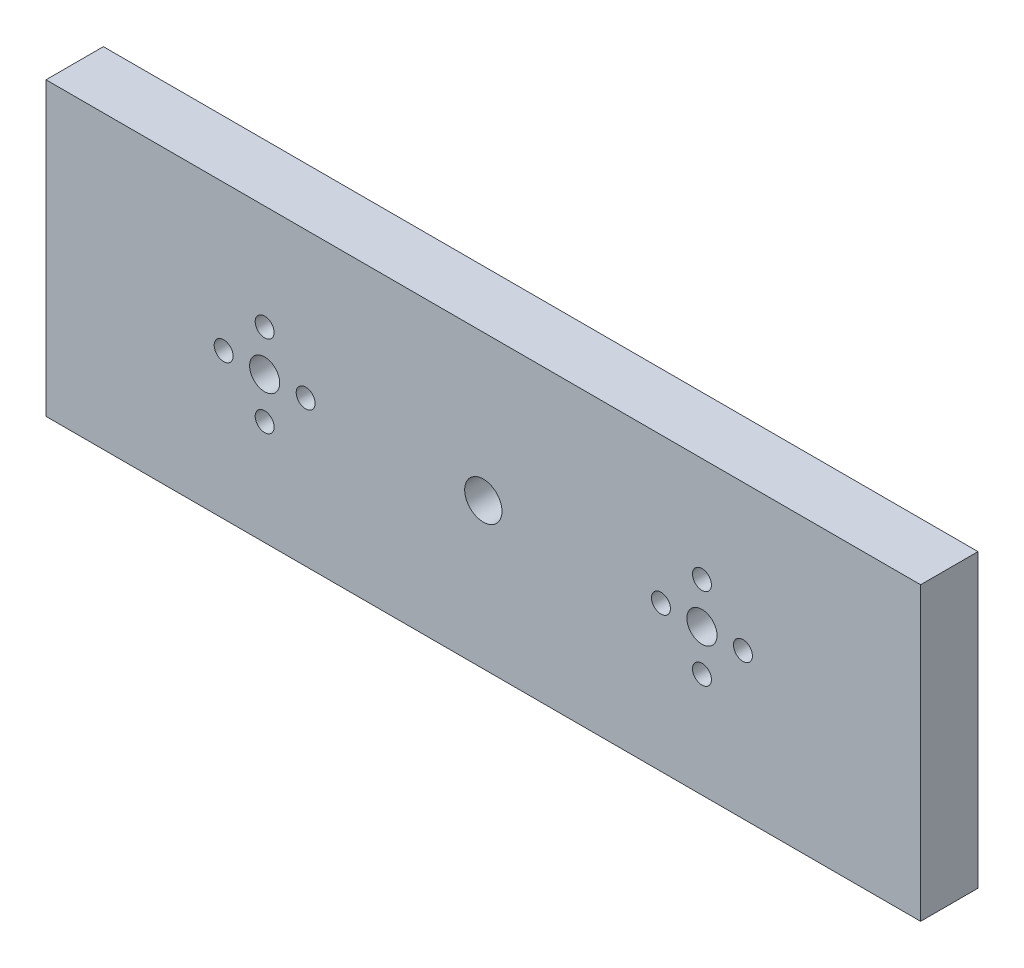
ISO-10303-21;
HEADER;
FILE_DESCRIPTION(('STEP AP214'),'2;1');
FILE_NAME('part.step','',(''),(''),'','','');
FILE_SCHEMA(('AUTOMOTIVE_DESIGN { 1 0 10303 214 1 1 1 1 }'));
ENDSEC;
DATA;
#1=APPLICATION_CONTEXT('core data for automotive mechanical design processes');
#2=APPLICATION_PROTOCOL_DEFINITION('international standard','automotive_design',2000,#1);
#3=PRODUCT_CONTEXT('',#1,'mechanical');
#4=PRODUCT('Part','Part','',(#3));
#5=PRODUCT_RELATED_PRODUCT_CATEGORY('part','',(#4));
#6=PRODUCT_DEFINITION_FORMATION('','',#4);
#7=PRODUCT_DEFINITION_CONTEXT('part definition',#1,'design');
#8=PRODUCT_DEFINITION('design','',#6,#7);
#9=PRODUCT_DEFINITION_SHAPE('','',#8);
#10=(LENGTH_UNIT() NAMED_UNIT(*) SI_UNIT(.MILLI.,.METRE.));
#11=(NAMED_UNIT(*) PLANE_ANGLE_UNIT() SI_UNIT($,.RADIAN.));
#12=(NAMED_UNIT(*) SI_UNIT($,.STERADIAN.) SOLID_ANGLE_UNIT());
#13=UNCERTAINTY_MEASURE_WITH_UNIT(LENGTH_MEASURE(1.E-05),#10,'distance_accuracy_value','');
#14=(GEOMETRIC_REPRESENTATION_CONTEXT(3) GLOBAL_UNCERTAINTY_ASSIGNED_CONTEXT((#13)) GLOBAL_UNIT_ASSIGNED_CONTEXT((#10,
#11,#12)) REPRESENTATION_CONTEXT('',''));
#15=CARTESIAN_POINT('',(0.,0.,0.));
#16=DIRECTION('',(0.,0.,1.));
#17=DIRECTION('',(1.,0.,0.));
#18=AXIS2_PLACEMENT_3D('',#15,#16,#17);
#19=CARTESIAN_POINT('',(76.2,14.2875,0.));
#20=DIRECTION('',(0.,0.,-1.));
#21=DIRECTION('',(1.,0.,0.));
#22=AXIS2_PLACEMENT_3D('',#19,#20,#21);
#23=CYLINDRICAL_SURFACE('',#22,3.3);
#24=DIRECTION('',(0.,0.,1.));
#25=VECTOR('',#24,1.);
#26=CARTESIAN_POINT('',(79.5,14.2875,0.));
#27=LINE('',#26,#25);
#28=CARTESIAN_POINT('',(79.5,14.2875,0.));
#29=VERTEX_POINT('',#28);
#30=CARTESIAN_POINT('',(79.5,14.2875,20.));
#31=VERTEX_POINT('',#30);
#32=EDGE_CURVE('E10',#29,#31,#27,.T.);
#33=ORIENTED_EDGE('',*,*,#32,.T.);
#34=CARTESIAN_POINT('',(76.2,14.2875,20.));
#35=DIRECTION('',(0.,0.,1.));
#36=DIRECTION('',(1.,0.,0.));
#37=AXIS2_PLACEMENT_3D('',#34,#35,#36);
#38=CIRCLE('',#37,3.3);
#39=EDGE_CURVE('E258',#31,#31,#38,.T.);
#40=ORIENTED_EDGE('',*,*,#39,.T.);
#41=ORIENTED_EDGE('',*,*,#32,.F.);
#42=CARTESIAN_POINT('',(76.2,14.2875,0.));
#43=DIRECTION('',(0.,0.,1.));
#44=DIRECTION('',(1.,0.,0.));
#45=AXIS2_PLACEMENT_3D('',#42,#43,#44);
#46=CIRCLE('',#45,3.3);
#47=EDGE_CURVE('E191',#29,#29,#46,.T.);
#48=ORIENTED_EDGE('',*,*,#47,.F.);
#49=EDGE_LOOP('',(#33,#40,#41,#48));
#50=FACE_BOUND('',#49,.T.);
#51=ADVANCED_FACE('F18',(#50),#23,.F.);
#52=CARTESIAN_POINT('',(90.4875,0.,0.));
#53=DIRECTION('',(0.,0.,-1.));
#54=DIRECTION('',(1.,0.,0.));
#55=AXIS2_PLACEMENT_3D('',#52,#53,#54);
#56=CYLINDRICAL_SURFACE('',#55,3.3);
#57=DIRECTION('',(0.,0.,1.));
#58=VECTOR('',#57,1.);
#59=CARTESIAN_POINT('',(93.7875,0.,0.));
#60=LINE('',#59,#58);
#61=CARTESIAN_POINT('',(93.7875,0.,0.));
#62=VERTEX_POINT('',#61);
#63=CARTESIAN_POINT('',(93.7875,0.,20.));
#64=VERTEX_POINT('',#63);
#65=EDGE_CURVE('E27',#62,#64,#60,.T.);
#66=ORIENTED_EDGE('',*,*,#65,.T.);
#67=CARTESIAN_POINT('',(90.4875,0.,20.));
#68=DIRECTION('',(0.,0.,1.));
#69=DIRECTION('',(1.,0.,0.));
#70=AXIS2_PLACEMENT_3D('',#67,#68,#69);
#71=CIRCLE('',#70,3.3);
#72=EDGE_CURVE('E265',#64,#64,#71,.T.);
#73=ORIENTED_EDGE('',*,*,#72,.T.);
#74=ORIENTED_EDGE('',*,*,#65,.F.);
#75=CARTESIAN_POINT('',(90.4875,0.,0.));
#76=DIRECTION('',(0.,0.,1.));
#77=DIRECTION('',(1.,0.,0.));
#78=AXIS2_PLACEMENT_3D('',#75,#76,#77);
#79=CIRCLE('',#78,3.3);
#80=EDGE_CURVE('E178',#62,#62,#79,.T.);
#81=ORIENTED_EDGE('',*,*,#80,.F.);
#82=EDGE_LOOP('',(#66,#73,#74,#81));
#83=FACE_BOUND('',#82,.T.);
#84=ADVANCED_FACE('F410',(#83),#56,.F.);
#85=CARTESIAN_POINT('',(76.2,0.,0.));
#86=DIRECTION('',(0.,0.,-1.));
#87=DIRECTION('',(1.,0.,0.));
#88=AXIS2_PLACEMENT_3D('',#85,#86,#87);
#89=CYLINDRICAL_SURFACE('',#88,5.25);
#90=DIRECTION('',(0.,0.,1.));
#91=VECTOR('',#90,1.);
#92=CARTESIAN_POINT('',(81.45,0.,0.));
#93=LINE('',#92,#91);
#94=CARTESIAN_POINT('',(81.45,0.,0.));
#95=VERTEX_POINT('',#94);
#96=CARTESIAN_POINT('',(81.45,0.,20.));
#97=VERTEX_POINT('',#96);
#98=EDGE_CURVE('E164',#95,#97,#93,.T.);
#99=ORIENTED_EDGE('',*,*,#98,.T.);
#100=CARTESIAN_POINT('',(76.2,0.,20.));
#101=DIRECTION('',(0.,0.,1.));
#102=DIRECTION('',(1.,0.,0.));
#103=AXIS2_PLACEMENT_3D('',#100,#101,#102);
#104=CIRCLE('',#103,5.25);
#105=EDGE_CURVE('E247',#97,#97,#104,.T.);
#106=ORIENTED_EDGE('',*,*,#105,.T.);
#107=ORIENTED_EDGE('',*,*,#98,.F.);
#108=CARTESIAN_POINT('',(76.2,0.,0.));
#109=DIRECTION('',(0.,0.,1.));
#110=DIRECTION('',(1.,0.,0.));
#111=AXIS2_PLACEMENT_3D('',#108,#109,#110);
#112=CIRCLE('',#111,5.25);
#113=EDGE_CURVE('E172',#95,#95,#112,.T.);
#114=ORIENTED_EDGE('',*,*,#113,.F.);
#115=EDGE_LOOP('',(#99,#106,#107,#114));
#116=FACE_BOUND('',#115,.T.);
#117=ADVANCED_FACE('F413',(#116),#89,.F.);
#118=CARTESIAN_POINT('',(61.9125,0.,0.));
#119=DIRECTION('',(0.,0.,-1.));
#120=DIRECTION('',(1.,0.,0.));
#121=AXIS2_PLACEMENT_3D('',#118,#119,#120);
#122=CYLINDRICAL_SURFACE('',#121,3.3);
#123=DIRECTION('',(0.,0.,1.));
#124=VECTOR('',#123,1.);
#125=CARTESIAN_POINT('',(65.2125,0.,0.));
#126=LINE('',#125,#124);
#127=CARTESIAN_POINT('',(65.2125,0.,0.));
#128=VERTEX_POINT('',#127);
#129=CARTESIAN_POINT('',(65.2125,0.,20.));
#130=VERTEX_POINT('',#129);
#131=EDGE_CURVE('E158',#128,#130,#126,.T.);
#132=ORIENTED_EDGE('',*,*,#131,.T.);
#133=CARTESIAN_POINT('',(61.9125,0.,20.));
#134=DIRECTION('',(0.,0.,1.));
#135=DIRECTION('',(1.,0.,0.));
#136=AXIS2_PLACEMENT_3D('',#133,#134,#135);
#137=CIRCLE('',#136,3.3);
#138=EDGE_CURVE('E162',#130,#130,#137,.T.);
#139=ORIENTED_EDGE('',*,*,#138,.T.);
#140=ORIENTED_EDGE('',*,*,#131,.F.);
#141=CARTESIAN_POINT('',(61.9125,0.,0.));
#142=DIRECTION('',(0.,0.,1.));
#143=DIRECTION('',(1.,0.,0.));
#144=AXIS2_PLACEMENT_3D('',#141,#142,#143);
#145=CIRCLE('',#144,3.3);
#146=EDGE_CURVE('E161',#128,#128,#145,.T.);
#147=ORIENTED_EDGE('',*,*,#146,.F.);
#148=EDGE_LOOP('',(#132,#139,#140,#147));
#149=FACE_BOUND('',#148,.T.);
#150=ADVANCED_FACE('F159',(#149),#122,.F.);
#151=CARTESIAN_POINT('',(-76.2,14.2875,0.));
#152=DIRECTION('',(0.,0.,-1.));
#153=DIRECTION('',(1.,0.,0.));
#154=AXIS2_PLACEMENT_3D('',#151,#152,#153);
#155=CYLINDRICAL_SURFACE('',#154,3.3);
#156=DIRECTION('',(0.,0.,1.));
#157=VECTOR('',#156,1.);
#158=CARTESIAN_POINT('',(-72.9,14.2875,0.));
#159=LINE('',#158,#157);
#160=CARTESIAN_POINT('',(-72.9,14.2875,0.));
#161=VERTEX_POINT('',#160);
#162=CARTESIAN_POINT('',(-72.9,14.2875,20.));
#163=VERTEX_POINT('',#162);
#164=EDGE_CURVE('E167',#161,#163,#159,.T.);
#165=ORIENTED_EDGE('',*,*,#164,.T.);
#166=CARTESIAN_POINT('',(-76.2,14.2875,20.));
#167=DIRECTION('',(0.,0.,1.));
#168=DIRECTION('',(1.,0.,0.));
#169=AXIS2_PLACEMENT_3D('',#166,#167,#168);
#170=CIRCLE('',#169,3.3);
#171=EDGE_CURVE('E238',#163,#163,#170,.T.);
#172=ORIENTED_EDGE('',*,*,#171,.T.);
#173=ORIENTED_EDGE('',*,*,#164,.F.);
#174=CARTESIAN_POINT('',(-76.2,14.2875,0.));
#175=DIRECTION('',(0.,0.,1.));
#176=DIRECTION('',(1.,0.,0.));
#177=AXIS2_PLACEMENT_3D('',#174,#175,#176);
#178=CIRCLE('',#177,3.3);
#179=EDGE_CURVE('E174',#161,#161,#178,.T.);
#180=ORIENTED_EDGE('',*,*,#179,.F.);
#181=EDGE_LOOP('',(#165,#172,#173,#180));
#182=FACE_BOUND('',#181,.T.);
#183=ADVANCED_FACE('F427',(#182),#155,.F.);
#184=CARTESIAN_POINT('',(0.,0.,0.));
#185=DIRECTION('',(0.,0.,-1.));
#186=DIRECTION('',(1.,0.,0.));
#187=AXIS2_PLACEMENT_3D('',#184,#185,#186);
#188=CYLINDRICAL_SURFACE('',#187,6.5);
#189=DIRECTION('',(0.,0.,1.));
#190=VECTOR('',#189,1.);
#191=CARTESIAN_POINT('',(6.5,0.,0.));
#192=LINE('',#191,#190);
#193=CARTESIAN_POINT('',(6.5,0.,0.));
#194=VERTEX_POINT('',#193);
#195=CARTESIAN_POINT('',(6.5,0.,20.));
#196=VERTEX_POINT('',#195);
#197=EDGE_CURVE('E280',#194,#196,#192,.T.);
#198=ORIENTED_EDGE('',*,*,#197,.T.);
#199=CARTESIAN_POINT('',(0.,0.,20.));
#200=DIRECTION('',(0.,0.,1.));
#201=DIRECTION('',(1.,0.,0.));
#202=AXIS2_PLACEMENT_3D('',#199,#200,#201);
#203=CIRCLE('',#202,6.5);
#204=EDGE_CURVE('E242',#196,#196,#203,.T.);
#205=ORIENTED_EDGE('',*,*,#204,.T.);
#206=ORIENTED_EDGE('',*,*,#197,.F.);
#207=CARTESIAN_POINT('',(0.,0.,0.));
#208=DIRECTION('',(0.,0.,1.));
#209=DIRECTION('',(1.,0.,0.));
#210=AXIS2_PLACEMENT_3D('',#207,#208,#209);
#211=CIRCLE('',#210,6.5);
#212=EDGE_CURVE('E183',#194,#194,#211,.T.);
#213=ORIENTED_EDGE('',*,*,#212,.F.);
#214=EDGE_LOOP('',(#198,#205,#206,#213));
#215=FACE_BOUND('',#214,.T.);
#216=ADVANCED_FACE('F274',(#215),#188,.F.);
#217=CARTESIAN_POINT('',(-61.9125,0.,0.));
#218=DIRECTION('',(0.,0.,-1.));
#219=DIRECTION('',(1.,0.,0.));
#220=AXIS2_PLACEMENT_3D('',#217,#218,#219);
#221=CYLINDRICAL_SURFACE('',#220,3.3);
#222=DIRECTION('',(0.,0.,1.));
#223=VECTOR('',#222,1.);
#224=CARTESIAN_POINT('',(-58.6125,0.,0.));
#225=LINE('',#224,#223);
#226=CARTESIAN_POINT('',(-58.6125,0.,0.));
#227=VERTEX_POINT('',#226);
#228=CARTESIAN_POINT('',(-58.6125,0.,20.));
#229=VERTEX_POINT('',#228);
#230=EDGE_CURVE('E278',#227,#229,#225,.T.);
#231=ORIENTED_EDGE('',*,*,#230,.T.);
#232=CARTESIAN_POINT('',(-61.9125,0.,20.));
#233=DIRECTION('',(0.,0.,1.));
#234=DIRECTION('',(1.,0.,0.));
#235=AXIS2_PLACEMENT_3D('',#232,#233,#234);
#236=CIRCLE('',#235,3.3);
#237=EDGE_CURVE('E552',#229,#229,#236,.T.);
#238=ORIENTED_EDGE('',*,*,#237,.T.);
#239=ORIENTED_EDGE('',*,*,#230,.F.);
#240=CARTESIAN_POINT('',(-61.9125,0.,0.));
#241=DIRECTION('',(0.,0.,1.));
#242=DIRECTION('',(1.,0.,0.));
#243=AXIS2_PLACEMENT_3D('',#240,#241,#242);
#244=CIRCLE('',#243,3.3);
#245=EDGE_CURVE('E213',#227,#227,#244,.T.);
#246=ORIENTED_EDGE('',*,*,#245,.F.);
#247=EDGE_LOOP('',(#231,#238,#239,#246));
#248=FACE_BOUND('',#247,.T.);
#249=ADVANCED_FACE('F425',(#248),#221,.F.);
#250=CARTESIAN_POINT('',(-76.2,0.,0.));
#251=DIRECTION('',(0.,0.,-1.));
#252=DIRECTION('',(1.,0.,0.));
#253=AXIS2_PLACEMENT_3D('',#250,#251,#252);
#254=CYLINDRICAL_SURFACE('',#253,5.25);
#255=DIRECTION('',(0.,0.,1.));
#256=VECTOR('',#255,1.);
#257=CARTESIAN_POINT('',(-70.95,0.,0.));
#258=LINE('',#257,#256);
#259=CARTESIAN_POINT('',(-70.95,0.,0.));
#260=VERTEX_POINT('',#259);
#261=CARTESIAN_POINT('',(-70.95,0.,20.));
#262=VERTEX_POINT('',#261);
#263=EDGE_CURVE('E287',#260,#262,#258,.T.);
#264=ORIENTED_EDGE('',*,*,#263,.T.);
#265=CARTESIAN_POINT('',(-76.2,0.,20.));
#266=DIRECTION('',(0.,0.,1.));
#267=DIRECTION('',(1.,0.,0.));
#268=AXIS2_PLACEMENT_3D('',#265,#266,#267);
#269=CIRCLE('',#268,5.25);
#270=EDGE_CURVE('E361',#262,#262,#269,.T.);
#271=ORIENTED_EDGE('',*,*,#270,.T.);
#272=ORIENTED_EDGE('',*,*,#263,.F.);
#273=CARTESIAN_POINT('',(-76.2,0.,0.));
#274=DIRECTION('',(0.,0.,1.));
#275=DIRECTION('',(1.,0.,0.));
#276=AXIS2_PLACEMENT_3D('',#273,#274,#275);
#277=CIRCLE('',#276,5.25);
#278=EDGE_CURVE('E217',#260,#260,#277,.T.);
#279=ORIENTED_EDGE('',*,*,#278,.F.);
#280=EDGE_LOOP('',(#264,#271,#272,#279));
#281=FACE_BOUND('',#280,.T.);
#282=ADVANCED_FACE('F363',(#281),#254,.F.);
#283=CARTESIAN_POINT('',(-90.4875,0.,0.));
#284=DIRECTION('',(0.,0.,-1.));
#285=DIRECTION('',(1.,0.,0.));
#286=AXIS2_PLACEMENT_3D('',#283,#284,#285);
#287=CYLINDRICAL_SURFACE('',#286,3.3);
#288=DIRECTION('',(0.,0.,1.));
#289=VECTOR('',#288,1.);
#290=CARTESIAN_POINT('',(-87.1875,0.,0.));
#291=LINE('',#290,#289);
#292=CARTESIAN_POINT('',(-87.1875,0.,0.));
#293=VERTEX_POINT('',#292);
#294=CARTESIAN_POINT('',(-87.1875,0.,20.));
#295=VERTEX_POINT('',#294);
#296=EDGE_CURVE('E349',#293,#295,#291,.T.);
#297=ORIENTED_EDGE('',*,*,#296,.T.);
#298=CARTESIAN_POINT('',(-90.4875,0.,20.));
#299=DIRECTION('',(0.,0.,1.));
#300=DIRECTION('',(1.,0.,0.));
#301=AXIS2_PLACEMENT_3D('',#298,#299,#300);
#302=CIRCLE('',#301,3.3);
#303=EDGE_CURVE('E558',#295,#295,#302,.T.);
#304=ORIENTED_EDGE('',*,*,#303,.T.);
#305=ORIENTED_EDGE('',*,*,#296,.F.);
#306=CARTESIAN_POINT('',(-90.4875,0.,0.));
#307=DIRECTION('',(0.,0.,1.));
#308=DIRECTION('',(1.,0.,0.));
#309=AXIS2_PLACEMENT_3D('',#306,#307,#308);
#310=CIRCLE('',#309,3.3);
#311=EDGE_CURVE('E263',#293,#293,#310,.T.);
#312=ORIENTED_EDGE('',*,*,#311,.F.);
#313=EDGE_LOOP('',(#297,#304,#305,#312));
#314=FACE_BOUND('',#313,.T.);
#315=ADVANCED_FACE('F423',(#314),#287,.F.);
#316=CARTESIAN_POINT('',(76.2,-14.2875,0.));
#317=DIRECTION('',(0.,0.,-1.));
#318=DIRECTION('',(1.,0.,0.));
#319=AXIS2_PLACEMENT_3D('',#316,#317,#318);
#320=CYLINDRICAL_SURFACE('',#319,3.3);
#321=DIRECTION('',(0.,0.,1.));
#322=VECTOR('',#321,1.);
#323=CARTESIAN_POINT('',(79.5,-14.2875,0.));
#324=LINE('',#323,#322);
#325=CARTESIAN_POINT('',(79.5,-14.2875,0.));
#326=VERTEX_POINT('',#325);
#327=CARTESIAN_POINT('',(79.5,-14.2875,20.));
#328=VERTEX_POINT('',#327);
#329=EDGE_CURVE('E348',#326,#328,#324,.T.);
#330=ORIENTED_EDGE('',*,*,#329,.T.);
#331=CARTESIAN_POINT('',(76.2,-14.2875,20.));
#332=DIRECTION('',(0.,0.,1.));
#333=DIRECTION('',(1.,0.,0.));
#334=AXIS2_PLACEMENT_3D('',#331,#332,#333);
#335=CIRCLE('',#334,3.3);
#336=EDGE_CURVE('E201',#328,#328,#335,.T.);
#337=ORIENTED_EDGE('',*,*,#336,.T.);
#338=ORIENTED_EDGE('',*,*,#329,.F.);
#339=CARTESIAN_POINT('',(76.2,-14.2875,0.));
#340=DIRECTION('',(0.,0.,1.));
#341=DIRECTION('',(1.,0.,0.));
#342=AXIS2_PLACEMENT_3D('',#339,#340,#341);
#343=CIRCLE('',#342,3.3);
#344=EDGE_CURVE('E299',#326,#326,#343,.T.);
#345=ORIENTED_EDGE('',*,*,#344,.F.);
#346=EDGE_LOOP('',(#330,#337,#338,#345));
#347=FACE_BOUND('',#346,.T.);
#348=ADVANCED_FACE('F401',(#347),#320,.F.);
#349=CARTESIAN_POINT('',(-76.2,-14.2875,0.));
#350=DIRECTION('',(0.,0.,-1.));
#351=DIRECTION('',(1.,0.,0.));
#352=AXIS2_PLACEMENT_3D('',#349,#350,#351);
#353=CYLINDRICAL_SURFACE('',#352,3.3);
#354=DIRECTION('',(0.,0.,1.));
#355=VECTOR('',#354,1.);
#356=CARTESIAN_POINT('',(-72.9,-14.2875,0.));
#357=LINE('',#356,#355);
#358=CARTESIAN_POINT('',(-72.9,-14.2875,0.));
#359=VERTEX_POINT('',#358);
#360=CARTESIAN_POINT('',(-72.9,-14.2875,20.));
#361=VERTEX_POINT('',#360);
#362=EDGE_CURVE('E261',#359,#361,#357,.T.);
#363=ORIENTED_EDGE('',*,*,#362,.T.);
#364=CARTESIAN_POINT('',(-76.2,-14.2875,20.));
#365=DIRECTION('',(0.,0.,1.));
#366=DIRECTION('',(1.,0.,0.));
#367=AXIS2_PLACEMENT_3D('',#364,#365,#366);
#368=CIRCLE('',#367,3.3);
#369=EDGE_CURVE('E196',#361,#361,#368,.T.);
#370=ORIENTED_EDGE('',*,*,#369,.T.);
#371=ORIENTED_EDGE('',*,*,#362,.F.);
#372=CARTESIAN_POINT('',(-76.2,-14.2875,0.));
#373=DIRECTION('',(0.,0.,1.));
#374=DIRECTION('',(1.,0.,0.));
#375=AXIS2_PLACEMENT_3D('',#372,#373,#374);
#376=CIRCLE('',#375,3.3);
#377=EDGE_CURVE('E297',#359,#359,#376,.T.);
#378=ORIENTED_EDGE('',*,*,#377,.F.);
#379=EDGE_LOOP('',(#363,#370,#371,#378));
#380=FACE_BOUND('',#379,.T.);
#381=ADVANCED_FACE('F391',(#380),#353,.F.);
#382=CARTESIAN_POINT('',(152.4,50.8,0.));
#383=DIRECTION('',(0.,-1.,0.));
#384=DIRECTION('',(0.,0.,-1.));
#385=AXIS2_PLACEMENT_3D('',#382,#383,#384);
#386=PLANE('',#385);
#387=DIRECTION('',(-1.,0.,0.));
#388=VECTOR('',#387,1.);
#389=CARTESIAN_POINT('',(152.4,50.8,0.));
#390=LINE('',#389,#388);
#391=CARTESIAN_POINT('',(152.4,50.8,0.));
#392=VERTEX_POINT('',#391);
#393=CARTESIAN_POINT('',(-152.4,50.8,0.));
#394=VERTEX_POINT('',#393);
#395=EDGE_CURVE('E309',#392,#394,#390,.T.);
#396=ORIENTED_EDGE('',*,*,#395,.T.);
#397=DIRECTION('',(0.,0.,1.));
#398=VECTOR('',#397,1.);
#399=CARTESIAN_POINT('',(-152.4,50.8,0.));
#400=LINE('',#399,#398);
#401=CARTESIAN_POINT('',(-152.4,50.8,20.));
#402=VERTEX_POINT('',#401);
#403=EDGE_CURVE('E334',#394,#402,#400,.T.);
#404=ORIENTED_EDGE('',*,*,#403,.T.);
#405=DIRECTION('',(-1.,0.,0.));
#406=VECTOR('',#405,1.);
#407=CARTESIAN_POINT('',(152.4,50.8,20.));
#408=LINE('',#407,#406);
#409=CARTESIAN_POINT('',(152.4,50.8,20.));
#410=VERTEX_POINT('',#409);
#411=EDGE_CURVE('E194',#410,#402,#408,.T.);
#412=ORIENTED_EDGE('',*,*,#411,.F.);
#413=DIRECTION('',(0.,0.,1.));
#414=VECTOR('',#413,1.);
#415=CARTESIAN_POINT('',(152.4,50.8,0.));
#416=LINE('',#415,#414);
#417=EDGE_CURVE('E323',#392,#410,#416,.T.);
#418=ORIENTED_EDGE('',*,*,#417,.F.);
#419=EDGE_LOOP('',(#396,#404,#412,#418));
#420=FACE_BOUND('',#419,.T.);
#421=ADVANCED_FACE('F386',(#420),#386,.F.);
#422=CARTESIAN_POINT('',(0.,0.,20.));
#423=DIRECTION('',(0.,0.,1.));
#424=DIRECTION('',(1.,0.,0.));
#425=AXIS2_PLACEMENT_3D('',#422,#423,#424);
#426=PLANE('',#425);
#427=ORIENTED_EDGE('',*,*,#39,.F.);
#428=EDGE_LOOP('',(#427));
#429=FACE_BOUND('',#428,.T.);
#430=ORIENTED_EDGE('',*,*,#72,.F.);
#431=EDGE_LOOP('',(#430));
#432=FACE_BOUND('',#431,.T.);
#433=ORIENTED_EDGE('',*,*,#105,.F.);
#434=EDGE_LOOP('',(#433));
#435=FACE_BOUND('',#434,.T.);
#436=ORIENTED_EDGE('',*,*,#138,.F.);
#437=EDGE_LOOP('',(#436));
#438=FACE_BOUND('',#437,.T.);
#439=ORIENTED_EDGE('',*,*,#171,.F.);
#440=EDGE_LOOP('',(#439));
#441=FACE_BOUND('',#440,.T.);
#442=ORIENTED_EDGE('',*,*,#204,.F.);
#443=EDGE_LOOP('',(#442));
#444=FACE_BOUND('',#443,.T.);
#445=ORIENTED_EDGE('',*,*,#237,.F.);
#446=EDGE_LOOP('',(#445));
#447=FACE_BOUND('',#446,.T.);
#448=ORIENTED_EDGE('',*,*,#270,.F.);
#449=EDGE_LOOP('',(#448));
#450=FACE_BOUND('',#449,.T.);
#451=ORIENTED_EDGE('',*,*,#303,.F.);
#452=EDGE_LOOP('',(#451));
#453=FACE_BOUND('',#452,.T.);
#454=ORIENTED_EDGE('',*,*,#336,.F.);
#455=EDGE_LOOP('',(#454));
#456=FACE_BOUND('',#455,.T.);
#457=ORIENTED_EDGE('',*,*,#369,.F.);
#458=EDGE_LOOP('',(#457));
#459=FACE_BOUND('',#458,.T.);
#460=DIRECTION('',(1.,0.,0.));
#461=VECTOR('',#460,1.);
#462=CARTESIAN_POINT('',(-152.4,-50.8,20.));
#463=LINE('',#462,#461);
#464=CARTESIAN_POINT('',(-152.4,-50.8,20.));
#465=VERTEX_POINT('',#464);
#466=CARTESIAN_POINT('',(152.4,-50.8,20.));
#467=VERTEX_POINT('',#466);
#468=EDGE_CURVE('E226',#465,#467,#463,.T.);
#469=ORIENTED_EDGE('',*,*,#468,.T.);
#470=DIRECTION('',(0.,1.,0.));
#471=VECTOR('',#470,1.);
#472=CARTESIAN_POINT('',(152.4,-50.8,20.));
#473=LINE('',#472,#471);
#474=EDGE_CURVE('E312',#467,#410,#473,.T.);
#475=ORIENTED_EDGE('',*,*,#474,.T.);
#476=ORIENTED_EDGE('',*,*,#411,.T.);
#477=DIRECTION('',(0.,-1.,0.));
#478=VECTOR('',#477,1.);
#479=CARTESIAN_POINT('',(-152.4,50.8,20.));
#480=LINE('',#479,#478);
#481=EDGE_CURVE('E333',#402,#465,#480,.T.);
#482=ORIENTED_EDGE('',*,*,#481,.T.);
#483=EDGE_LOOP('',(#469,#475,#476,#482));
#484=FACE_BOUND('',#483,.T.);
#485=ADVANCED_FACE('F366',(#429,#432,#435,#438,#441,#444,#447,#450,#453,#456,#459,#484),#426,.T.);
#486=CARTESIAN_POINT('',(0.,0.,0.));
#487=DIRECTION('',(0.,0.,1.));
#488=DIRECTION('',(1.,0.,0.));
#489=AXIS2_PLACEMENT_3D('',#486,#487,#488);
#490=PLANE('',#489);
#491=ORIENTED_EDGE('',*,*,#47,.T.);
#492=EDGE_LOOP('',(#491));
#493=FACE_BOUND('',#492,.T.);
#494=ORIENTED_EDGE('',*,*,#80,.T.);
#495=EDGE_LOOP('',(#494));
#496=FACE_BOUND('',#495,.T.);
#497=ORIENTED_EDGE('',*,*,#113,.T.);
#498=EDGE_LOOP('',(#497));
#499=FACE_BOUND('',#498,.T.);
#500=ORIENTED_EDGE('',*,*,#146,.T.);
#501=EDGE_LOOP('',(#500));
#502=FACE_BOUND('',#501,.T.);
#503=ORIENTED_EDGE('',*,*,#179,.T.);
#504=EDGE_LOOP('',(#503));
#505=FACE_BOUND('',#504,.T.);
#506=ORIENTED_EDGE('',*,*,#212,.T.);
#507=EDGE_LOOP('',(#506));
#508=FACE_BOUND('',#507,.T.);
#509=ORIENTED_EDGE('',*,*,#245,.T.);
#510=EDGE_LOOP('',(#509));
#511=FACE_BOUND('',#510,.T.);
#512=ORIENTED_EDGE('',*,*,#278,.T.);
#513=EDGE_LOOP('',(#512));
#514=FACE_BOUND('',#513,.T.);
#515=ORIENTED_EDGE('',*,*,#311,.T.);
#516=EDGE_LOOP('',(#515));
#517=FACE_BOUND('',#516,.T.);
#518=ORIENTED_EDGE('',*,*,#344,.T.);
#519=EDGE_LOOP('',(#518));
#520=FACE_BOUND('',#519,.T.);
#521=ORIENTED_EDGE('',*,*,#377,.T.);
#522=EDGE_LOOP('',(#521));
#523=FACE_BOUND('',#522,.T.);
#524=DIRECTION('',(0.,-1.,0.));
#525=VECTOR('',#524,1.);
#526=CARTESIAN_POINT('',(-152.4,50.8,0.));
#527=LINE('',#526,#525);
#528=CARTESIAN_POINT('',(-152.4,-50.8,0.));
#529=VERTEX_POINT('',#528);
#530=EDGE_CURVE('E339',#394,#529,#527,.T.);
#531=ORIENTED_EDGE('',*,*,#530,.F.);
#532=ORIENTED_EDGE('',*,*,#395,.F.);
#533=DIRECTION('',(0.,1.,0.));
#534=VECTOR('',#533,1.);
#535=CARTESIAN_POINT('',(152.4,-50.8,0.));
#536=LINE('',#535,#534);
#537=CARTESIAN_POINT('',(152.4,-50.8,0.));
#538=VERTEX_POINT('',#537);
#539=EDGE_CURVE('E328',#538,#392,#536,.T.);
#540=ORIENTED_EDGE('',*,*,#539,.F.);
#541=DIRECTION('',(1.,0.,0.));
#542=VECTOR('',#541,1.);
#543=CARTESIAN_POINT('',(-152.4,-50.8,0.));
#544=LINE('',#543,#542);
#545=EDGE_CURVE('E218',#529,#538,#544,.T.);
#546=ORIENTED_EDGE('',*,*,#545,.F.);
#547=EDGE_LOOP('',(#531,#532,#540,#546));
#548=FACE_BOUND('',#547,.T.);
#549=ADVANCED_FACE('F166',(#493,#496,#499,#502,#505,#508,#511,#514,#517,#520,#523,#548),#490,.F.);
#550=CARTESIAN_POINT('',(152.4,-50.8,0.));
#551=DIRECTION('',(-1.,0.,0.));
#552=DIRECTION('',(0.,0.,1.));
#553=AXIS2_PLACEMENT_3D('',#550,#551,#552);
#554=PLANE('',#553);
#555=ORIENTED_EDGE('',*,*,#539,.T.);
#556=ORIENTED_EDGE('',*,*,#417,.T.);
#557=ORIENTED_EDGE('',*,*,#474,.F.);
#558=DIRECTION('',(0.,0.,1.));
#559=VECTOR('',#558,1.);
#560=CARTESIAN_POINT('',(152.4,-50.8,0.));
#561=LINE('',#560,#559);
#562=EDGE_CURVE('E225',#538,#467,#561,.T.);
#563=ORIENTED_EDGE('',*,*,#562,.F.);
#564=EDGE_LOOP('',(#555,#556,#557,#563));
#565=FACE_BOUND('',#564,.T.);
#566=ADVANCED_FACE('F370',(#565),#554,.F.);
#567=CARTESIAN_POINT('',(-152.4,50.8,0.));
#568=DIRECTION('',(1.,0.,0.));
#569=DIRECTION('',(0.,1.,0.));
#570=AXIS2_PLACEMENT_3D('',#567,#568,#569);
#571=PLANE('',#570);
#572=ORIENTED_EDGE('',*,*,#530,.T.);
#573=DIRECTION('',(0.,0.,1.));
#574=VECTOR('',#573,1.);
#575=CARTESIAN_POINT('',(-152.4,-50.8,0.));
#576=LINE('',#575,#574);
#577=EDGE_CURVE('E232',#529,#465,#576,.T.);
#578=ORIENTED_EDGE('',*,*,#577,.T.);
#579=ORIENTED_EDGE('',*,*,#481,.F.);
#580=ORIENTED_EDGE('',*,*,#403,.F.);
#581=EDGE_LOOP('',(#572,#578,#579,#580));
#582=FACE_BOUND('',#581,.T.);
#583=ADVANCED_FACE('F383',(#582),#571,.F.);
#584=CARTESIAN_POINT('',(-152.4,-50.8,0.));
#585=DIRECTION('',(0.,1.,0.));
#586=DIRECTION('',(1.,0.,0.));
#587=AXIS2_PLACEMENT_3D('',#584,#585,#586);
#588=PLANE('',#587);
#589=ORIENTED_EDGE('',*,*,#545,.T.);
#590=ORIENTED_EDGE('',*,*,#562,.T.);
#591=ORIENTED_EDGE('',*,*,#468,.F.);
#592=ORIENTED_EDGE('',*,*,#577,.F.);
#593=EDGE_LOOP('',(#589,#590,#591,#592));
#594=FACE_BOUND('',#593,.T.);
#595=ADVANCED_FACE('F387',(#594),#588,.F.);
#596=CLOSED_SHELL('',(#51,#84,#117,#150,#183,#216,#249,#282,#315,#348,#381,#421,#485,#549,#566,
#583,#595));
#597=MANIFOLD_SOLID_BREP('B1',#596);
#598=ADVANCED_BREP_SHAPE_REPRESENTATION('',(#18,#597),#14);
#599=SHAPE_DEFINITION_REPRESENTATION(#9,#598);
ENDSEC;
END-ISO-10303-21;
